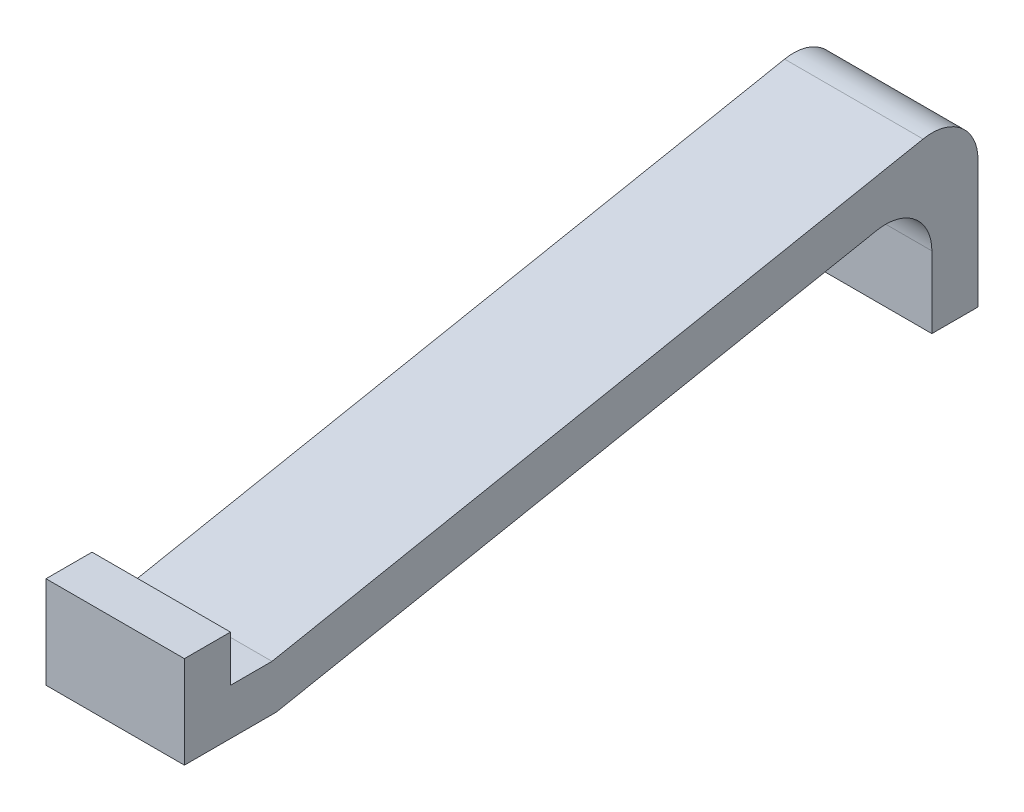
ISO-10303-21;
HEADER;
FILE_DESCRIPTION(('STEP AP214'),'2;1');
FILE_NAME('part.step','',(''),(''),'','','');
FILE_SCHEMA(('AUTOMOTIVE_DESIGN { 1 0 10303 214 1 1 1 1 }'));
ENDSEC;
DATA;
#1=APPLICATION_CONTEXT('core data for automotive mechanical design processes');
#2=APPLICATION_PROTOCOL_DEFINITION('international standard','automotive_design',2000,#1);
#3=PRODUCT_CONTEXT('',#1,'mechanical');
#4=PRODUCT('Part','Part','',(#3));
#5=PRODUCT_RELATED_PRODUCT_CATEGORY('part','',(#4));
#6=PRODUCT_DEFINITION_FORMATION('','',#4);
#7=PRODUCT_DEFINITION_CONTEXT('part definition',#1,'design');
#8=PRODUCT_DEFINITION('design','',#6,#7);
#9=PRODUCT_DEFINITION_SHAPE('','',#8);
#10=(LENGTH_UNIT() NAMED_UNIT(*) SI_UNIT(.MILLI.,.METRE.));
#11=(NAMED_UNIT(*) PLANE_ANGLE_UNIT() SI_UNIT($,.RADIAN.));
#12=(NAMED_UNIT(*) SI_UNIT($,.STERADIAN.) SOLID_ANGLE_UNIT());
#13=UNCERTAINTY_MEASURE_WITH_UNIT(LENGTH_MEASURE(1.E-05),#10,'distance_accuracy_value','');
#14=(GEOMETRIC_REPRESENTATION_CONTEXT(3) GLOBAL_UNCERTAINTY_ASSIGNED_CONTEXT((#13)) GLOBAL_UNIT_ASSIGNED_CONTEXT((#10,
#11,#12)) REPRESENTATION_CONTEXT('',''));
#15=CARTESIAN_POINT('',(0.,0.,0.));
#16=DIRECTION('',(0.,0.,1.));
#17=DIRECTION('',(1.,0.,0.));
#18=AXIS2_PLACEMENT_3D('',#15,#16,#17);
#19=CARTESIAN_POINT('',(30.,20.,102.260641264814));
#20=DIRECTION('',(0.,0.,-1.));
#21=DIRECTION('',(-1.,0.,0.));
#22=AXIS2_PLACEMENT_3D('',#19,#20,#21);
#23=PLANE('',#22);
#24=DIRECTION('',(0.,-1.,0.));
#25=VECTOR('',#24,1.);
#26=CARTESIAN_POINT('',(0.,20.,102.260641264814));
#27=LINE('',#26,#25);
#28=CARTESIAN_POINT('',(0.,20.,102.260641264814));
#29=VERTEX_POINT('',#28);
#30=CARTESIAN_POINT('',(0.,0.,102.260641264814));
#31=VERTEX_POINT('',#30);
#32=EDGE_CURVE('E153',#29,#31,#27,.T.);
#33=ORIENTED_EDGE('',*,*,#32,.T.);
#34=DIRECTION('',(-1.,0.,0.));
#35=VECTOR('',#34,1.);
#36=CARTESIAN_POINT('',(30.,0.,102.260641264814));
#37=LINE('',#36,#35);
#38=CARTESIAN_POINT('',(30.,0.,102.260641264814));
#39=VERTEX_POINT('',#38);
#40=EDGE_CURVE('E11',#39,#31,#37,.T.);
#41=ORIENTED_EDGE('',*,*,#40,.F.);
#42=DIRECTION('',(0.,-1.,0.));
#43=VECTOR('',#42,1.);
#44=CARTESIAN_POINT('',(30.,20.,102.260641264814));
#45=LINE('',#44,#43);
#46=CARTESIAN_POINT('',(30.,20.,102.260641264814));
#47=VERTEX_POINT('',#46);
#48=EDGE_CURVE('E175',#47,#39,#45,.T.);
#49=ORIENTED_EDGE('',*,*,#48,.F.);
#50=DIRECTION('',(-1.,0.,0.));
#51=VECTOR('',#50,1.);
#52=CARTESIAN_POINT('',(30.,20.,102.260641264814));
#53=LINE('',#52,#51);
#54=EDGE_CURVE('E149',#47,#29,#53,.T.);
#55=ORIENTED_EDGE('',*,*,#54,.T.);
#56=EDGE_LOOP('',(#33,#41,#49,#55));
#57=FACE_BOUND('',#56,.T.);
#58=ADVANCED_FACE('F33',(#57),#23,.F.);
#59=CARTESIAN_POINT('',(30.,0.,102.260641264814));
#60=DIRECTION('',(0.,1.,0.));
#61=DIRECTION('',(0.,0.,1.));
#62=AXIS2_PLACEMENT_3D('',#59,#60,#61);
#63=PLANE('',#62);
#64=DIRECTION('',(0.,0.,-1.));
#65=VECTOR('',#64,1.);
#66=CARTESIAN_POINT('',(0.,0.,102.260641264814));
#67=LINE('',#66,#65);
#68=CARTESIAN_POINT('',(0.,0.,82.3073454082652));
#69=VERTEX_POINT('',#68);
#70=EDGE_CURVE('E156',#31,#69,#67,.T.);
#71=ORIENTED_EDGE('',*,*,#70,.T.);
#72=DIRECTION('',(-1.,0.,0.));
#73=VECTOR('',#72,1.);
#74=CARTESIAN_POINT('',(30.,0.,82.3073454082652));
#75=LINE('',#74,#73);
#76=CARTESIAN_POINT('',(30.,0.,82.3073454082652));
#77=VERTEX_POINT('',#76);
#78=EDGE_CURVE('E41',#77,#69,#75,.T.);
#79=ORIENTED_EDGE('',*,*,#78,.F.);
#80=DIRECTION('',(0.,0.,-1.));
#81=VECTOR('',#80,1.);
#82=CARTESIAN_POINT('',(30.,0.,102.260641264814));
#83=LINE('',#82,#81);
#84=EDGE_CURVE('E104',#39,#77,#83,.T.);
#85=ORIENTED_EDGE('',*,*,#84,.F.);
#86=ORIENTED_EDGE('',*,*,#40,.T.);
#87=EDGE_LOOP('',(#71,#79,#85,#86));
#88=FACE_BOUND('',#87,.T.);
#89=ADVANCED_FACE('F253',(#88),#63,.F.);
#90=CARTESIAN_POINT('',(30.,0.,82.3073454082652));
#91=DIRECTION('',(0.,0.981546986641816,0.191221110273866));
#92=DIRECTION('',(0.,-0.191221110273866,0.981546986641817));
#93=AXIS2_PLACEMENT_3D('',#90,#91,#92);
#94=PLANE('',#93);
#95=DIRECTION('',(0.,0.191221110273866,-0.981546986641816));
#96=VECTOR('',#95,1.);
#97=CARTESIAN_POINT('',(0.,0.,82.3073454082652));
#98=LINE('',#97,#96);
#99=CARTESIAN_POINT('',(0.,25.3526310835087,-47.8289068487149));
#100=VERTEX_POINT('',#99);
#101=EDGE_CURVE('E158',#69,#100,#98,.T.);
#102=ORIENTED_EDGE('',*,*,#101,.T.);
#103=DIRECTION('',(-1.,0.,0.));
#104=VECTOR('',#103,1.);
#105=CARTESIAN_POINT('',(30.,25.3526310835087,-47.8289068487149));
#106=LINE('',#105,#104);
#107=CARTESIAN_POINT('',(30.,25.3526310835087,-47.8289068487149));
#108=VERTEX_POINT('',#107);
#109=EDGE_CURVE('E194',#108,#100,#106,.T.);
#110=ORIENTED_EDGE('',*,*,#109,.F.);
#111=DIRECTION('',(0.,0.191221110273866,-0.981546986641816));
#112=VECTOR('',#111,1.);
#113=CARTESIAN_POINT('',(30.,0.,82.3073454082652));
#114=LINE('',#113,#112);
#115=EDGE_CURVE('E202',#77,#108,#114,.T.);
#116=ORIENTED_EDGE('',*,*,#115,.F.);
#117=ORIENTED_EDGE('',*,*,#78,.T.);
#118=EDGE_LOOP('',(#102,#110,#116,#117));
#119=FACE_BOUND('',#118,.T.);
#120=ADVANCED_FACE('F200',(#119),#94,.F.);
#121=CARTESIAN_POINT('',(30.,15.5371612170905,-49.7411179514537));
#122=DIRECTION('',(-1.,0.,0.));
#123=DIRECTION('',(0.,0.,1.));
#124=AXIS2_PLACEMENT_3D('',#121,#122,#123);
#125=CYLINDRICAL_SURFACE('',#124,10.);
#126=CARTESIAN_POINT('',(0.,15.5371612170905,-49.7411179514537));
#127=DIRECTION('',(-1.,0.,0.));
#128=DIRECTION('',(0.,0.,1.));
#129=AXIS2_PLACEMENT_3D('',#126,#127,#128);
#130=CIRCLE('',#129,10.);
#131=CARTESIAN_POINT('',(0.,15.5371612170904,-59.7411179514537));
#132=VERTEX_POINT('',#131);
#133=EDGE_CURVE('E160',#100,#132,#130,.T.);
#134=ORIENTED_EDGE('',*,*,#133,.T.);
#135=DIRECTION('',(-1.,0.,0.));
#136=VECTOR('',#135,1.);
#137=CARTESIAN_POINT('',(30.,15.5371612170904,-59.7411179514537));
#138=LINE('',#137,#136);
#139=CARTESIAN_POINT('',(30.,15.5371612170904,-59.7411179514537));
#140=VERTEX_POINT('',#139);
#141=EDGE_CURVE('E191',#140,#132,#138,.T.);
#142=ORIENTED_EDGE('',*,*,#141,.F.);
#143=CARTESIAN_POINT('',(30.,15.5371612170905,-49.7411179514537));
#144=DIRECTION('',(-1.,0.,0.));
#145=DIRECTION('',(0.,0.,1.));
#146=AXIS2_PLACEMENT_3D('',#143,#144,#145);
#147=CIRCLE('',#146,10.);
#148=EDGE_CURVE('E220',#108,#140,#147,.T.);
#149=ORIENTED_EDGE('',*,*,#148,.F.);
#150=ORIENTED_EDGE('',*,*,#109,.T.);
#151=EDGE_LOOP('',(#134,#142,#149,#150));
#152=FACE_BOUND('',#151,.T.);
#153=ADVANCED_FACE('F211',(#152),#125,.F.);
#154=CARTESIAN_POINT('',(30.,15.5371612170904,-59.7411179514537));
#155=DIRECTION('',(0.,0.,-1.));
#156=DIRECTION('',(0.,1.,0.));
#157=AXIS2_PLACEMENT_3D('',#154,#155,#156);
#158=PLANE('',#157);
#159=DIRECTION('',(0.,-1.,0.));
#160=VECTOR('',#159,1.);
#161=CARTESIAN_POINT('',(0.,15.5371612170904,-59.7411179514537));
#162=LINE('',#161,#160);
#163=CARTESIAN_POINT('',(0.,0.,-59.7411179514537));
#164=VERTEX_POINT('',#163);
#165=EDGE_CURVE('E162',#132,#164,#162,.T.);
#166=ORIENTED_EDGE('',*,*,#165,.T.);
#167=DIRECTION('',(-1.,0.,0.));
#168=VECTOR('',#167,1.);
#169=CARTESIAN_POINT('',(30.,0.,-59.7411179514537));
#170=LINE('',#169,#168);
#171=CARTESIAN_POINT('',(30.,0.,-59.7411179514537));
#172=VERTEX_POINT('',#171);
#173=EDGE_CURVE('E188',#172,#164,#170,.T.);
#174=ORIENTED_EDGE('',*,*,#173,.F.);
#175=DIRECTION('',(0.,-1.,0.));
#176=VECTOR('',#175,1.);
#177=CARTESIAN_POINT('',(30.,15.5371612170904,-59.7411179514537));
#178=LINE('',#177,#176);
#179=EDGE_CURVE('E217',#140,#172,#178,.T.);
#180=ORIENTED_EDGE('',*,*,#179,.F.);
#181=ORIENTED_EDGE('',*,*,#141,.T.);
#182=EDGE_LOOP('',(#166,#174,#180,#181));
#183=FACE_BOUND('',#182,.T.);
#184=ADVANCED_FACE('F215',(#183),#158,.F.);
#185=CARTESIAN_POINT('',(30.,0.,-59.7411179514537));
#186=DIRECTION('',(0.,1.,0.));
#187=DIRECTION('',(0.,0.,1.));
#188=AXIS2_PLACEMENT_3D('',#185,#186,#187);
#189=PLANE('',#188);
#190=DIRECTION('',(0.,0.,-1.));
#191=VECTOR('',#190,1.);
#192=CARTESIAN_POINT('',(0.,0.,-59.7411179514537));
#193=LINE('',#192,#191);
#194=CARTESIAN_POINT('',(0.,0.,-69.7411179514537));
#195=VERTEX_POINT('',#194);
#196=EDGE_CURVE('E164',#164,#195,#193,.T.);
#197=ORIENTED_EDGE('',*,*,#196,.T.);
#198=DIRECTION('',(-1.,0.,0.));
#199=VECTOR('',#198,1.);
#200=CARTESIAN_POINT('',(30.,0.,-69.7411179514537));
#201=LINE('',#200,#199);
#202=CARTESIAN_POINT('',(30.,0.,-69.7411179514537));
#203=VERTEX_POINT('',#202);
#204=EDGE_CURVE('E185',#203,#195,#201,.T.);
#205=ORIENTED_EDGE('',*,*,#204,.F.);
#206=DIRECTION('',(0.,0.,-1.));
#207=VECTOR('',#206,1.);
#208=CARTESIAN_POINT('',(30.,0.,-59.7411179514537));
#209=LINE('',#208,#207);
#210=EDGE_CURVE('E219',#172,#203,#209,.T.);
#211=ORIENTED_EDGE('',*,*,#210,.F.);
#212=ORIENTED_EDGE('',*,*,#173,.T.);
#213=EDGE_LOOP('',(#197,#205,#211,#212));
#214=FACE_BOUND('',#213,.T.);
#215=ADVANCED_FACE('F266',(#214),#189,.F.);
#216=CARTESIAN_POINT('',(30.,0.,-69.7411179514537));
#217=DIRECTION('',(0.,0.,1.));
#218=DIRECTION('',(1.,0.,0.));
#219=AXIS2_PLACEMENT_3D('',#216,#217,#218);
#220=PLANE('',#219);
#221=DIRECTION('',(0.,1.,0.));
#222=VECTOR('',#221,1.);
#223=CARTESIAN_POINT('',(0.,0.,-69.7411179514537));
#224=LINE('',#223,#222);
#225=CARTESIAN_POINT('',(0.,27.6733210391425,-69.7411179514537));
#226=VERTEX_POINT('',#225);
#227=EDGE_CURVE('E166',#195,#226,#224,.T.);
#228=ORIENTED_EDGE('',*,*,#227,.T.);
#229=DIRECTION('',(-1.,0.,0.));
#230=VECTOR('',#229,1.);
#231=CARTESIAN_POINT('',(30.,27.6733210391425,-69.7411179514537));
#232=LINE('',#231,#230);
#233=CARTESIAN_POINT('',(30.,27.6733210391425,-69.7411179514537));
#234=VERTEX_POINT('',#233);
#235=EDGE_CURVE('E182',#234,#226,#232,.T.);
#236=ORIENTED_EDGE('',*,*,#235,.F.);
#237=DIRECTION('',(0.,1.,0.));
#238=VECTOR('',#237,1.);
#239=CARTESIAN_POINT('',(30.,0.,-69.7411179514537));
#240=LINE('',#239,#238);
#241=EDGE_CURVE('E222',#203,#234,#240,.T.);
#242=ORIENTED_EDGE('',*,*,#241,.F.);
#243=ORIENTED_EDGE('',*,*,#204,.T.);
#244=EDGE_LOOP('',(#228,#236,#242,#243));
#245=FACE_BOUND('',#244,.T.);
#246=ADVANCED_FACE('F269',(#245),#220,.F.);
#247=CARTESIAN_POINT('',(30.,27.6733210391426,-59.7411179514537));
#248=DIRECTION('',(-1.,0.,0.));
#249=DIRECTION('',(0.,0.,1.));
#250=AXIS2_PLACEMENT_3D('',#247,#248,#249);
#251=CYLINDRICAL_SURFACE('',#250,10.);
#252=CARTESIAN_POINT('',(0.,27.6733210391426,-59.7411179514537));
#253=DIRECTION('',(1.,0.,0.));
#254=DIRECTION('',(0.,0.,-1.));
#255=AXIS2_PLACEMENT_3D('',#252,#253,#254);
#256=CIRCLE('',#255,10.);
#257=CARTESIAN_POINT('',(0.,37.4887909055607,-57.8289068487149));
#258=VERTEX_POINT('',#257);
#259=EDGE_CURVE('E168',#226,#258,#256,.T.);
#260=ORIENTED_EDGE('',*,*,#259,.T.);
#261=DIRECTION('',(-1.,0.,0.));
#262=VECTOR('',#261,1.);
#263=CARTESIAN_POINT('',(30.,37.4887909055607,-57.8289068487149));
#264=LINE('',#263,#262);
#265=CARTESIAN_POINT('',(30.,37.4887909055607,-57.8289068487149));
#266=VERTEX_POINT('',#265);
#267=EDGE_CURVE('E179',#266,#258,#264,.T.);
#268=ORIENTED_EDGE('',*,*,#267,.F.);
#269=CARTESIAN_POINT('',(30.,27.6733210391426,-59.7411179514537));
#270=DIRECTION('',(1.,0.,0.));
#271=DIRECTION('',(0.,0.,-1.));
#272=AXIS2_PLACEMENT_3D('',#269,#270,#271);
#273=CIRCLE('',#272,10.);
#274=EDGE_CURVE('E228',#234,#266,#273,.T.);
#275=ORIENTED_EDGE('',*,*,#274,.F.);
#276=ORIENTED_EDGE('',*,*,#235,.T.);
#277=EDGE_LOOP('',(#260,#268,#275,#276));
#278=FACE_BOUND('',#277,.T.);
#279=ADVANCED_FACE('F234',(#278),#251,.T.);
#280=CARTESIAN_POINT('',(30.,37.4887909055607,-57.8289068487149));
#281=DIRECTION('',(0.,-0.981546986641816,-0.191221110273866));
#282=DIRECTION('',(0.,0.191221110273866,-0.981546986641816));
#283=AXIS2_PLACEMENT_3D('',#280,#281,#282);
#284=PLANE('',#283);
#285=DIRECTION('',(0.,-0.191221110273866,0.981546986641816));
#286=VECTOR('',#285,1.);
#287=CARTESIAN_POINT('',(0.,37.4887909055607,-57.8289068487149));
#288=LINE('',#287,#286);
#289=CARTESIAN_POINT('',(0.,10.,83.2723546236052));
#290=VERTEX_POINT('',#289);
#291=EDGE_CURVE('E170',#258,#290,#288,.T.);
#292=ORIENTED_EDGE('',*,*,#291,.T.);
#293=DIRECTION('',(-1.,0.,0.));
#294=VECTOR('',#293,1.);
#295=CARTESIAN_POINT('',(30.,10.,83.2723546236052));
#296=LINE('',#295,#294);
#297=CARTESIAN_POINT('',(30.,10.,83.2723546236052));
#298=VERTEX_POINT('',#297);
#299=EDGE_CURVE('E144',#298,#290,#296,.T.);
#300=ORIENTED_EDGE('',*,*,#299,.F.);
#301=DIRECTION('',(0.,-0.191221110273866,0.981546986641816));
#302=VECTOR('',#301,1.);
#303=CARTESIAN_POINT('',(30.,37.4887909055607,-57.8289068487149));
#304=LINE('',#303,#302);
#305=EDGE_CURVE('E135',#266,#298,#304,.T.);
#306=ORIENTED_EDGE('',*,*,#305,.F.);
#307=ORIENTED_EDGE('',*,*,#267,.T.);
#308=EDGE_LOOP('',(#292,#300,#306,#307));
#309=FACE_BOUND('',#308,.T.);
#310=ADVANCED_FACE('F238',(#309),#284,.F.);
#311=CARTESIAN_POINT('',(30.,10.,83.2723546236052));
#312=DIRECTION('',(0.,-1.,0.));
#313=DIRECTION('',(0.,0.,-1.));
#314=AXIS2_PLACEMENT_3D('',#311,#312,#313);
#315=PLANE('',#314);
#316=DIRECTION('',(0.,0.,1.));
#317=VECTOR('',#316,1.);
#318=CARTESIAN_POINT('',(0.,10.,83.2723546236052));
#319=LINE('',#318,#317);
#320=CARTESIAN_POINT('',(0.,10.,92.2839933365398));
#321=VERTEX_POINT('',#320);
#322=EDGE_CURVE('E143',#290,#321,#319,.T.);
#323=ORIENTED_EDGE('',*,*,#322,.T.);
#324=DIRECTION('',(-1.,0.,0.));
#325=VECTOR('',#324,1.);
#326=CARTESIAN_POINT('',(30.,10.,92.2839933365398));
#327=LINE('',#326,#325);
#328=CARTESIAN_POINT('',(30.,10.,92.2839933365398));
#329=VERTEX_POINT('',#328);
#330=EDGE_CURVE('E140',#329,#321,#327,.T.);
#331=ORIENTED_EDGE('',*,*,#330,.F.);
#332=DIRECTION('',(0.,0.,1.));
#333=VECTOR('',#332,1.);
#334=CARTESIAN_POINT('',(30.,10.,83.2723546236052));
#335=LINE('',#334,#333);
#336=EDGE_CURVE('E129',#298,#329,#335,.T.);
#337=ORIENTED_EDGE('',*,*,#336,.F.);
#338=ORIENTED_EDGE('',*,*,#299,.T.);
#339=EDGE_LOOP('',(#323,#331,#337,#338));
#340=FACE_BOUND('',#339,.T.);
#341=ADVANCED_FACE('F141',(#340),#315,.F.);
#342=CARTESIAN_POINT('',(30.,10.,92.2839933365398));
#343=DIRECTION('',(0.,0.,1.));
#344=DIRECTION('',(1.,0.,0.));
#345=AXIS2_PLACEMENT_3D('',#342,#343,#344);
#346=PLANE('',#345);
#347=DIRECTION('',(0.,1.,0.));
#348=VECTOR('',#347,1.);
#349=CARTESIAN_POINT('',(0.,10.,92.2839933365398));
#350=LINE('',#349,#348);
#351=CARTESIAN_POINT('',(0.,20.,92.2839933365398));
#352=VERTEX_POINT('',#351);
#353=EDGE_CURVE('E90',#321,#352,#350,.T.);
#354=ORIENTED_EDGE('',*,*,#353,.T.);
#355=DIRECTION('',(-1.,0.,0.));
#356=VECTOR('',#355,1.);
#357=CARTESIAN_POINT('',(30.,20.,92.2839933365398));
#358=LINE('',#357,#356);
#359=CARTESIAN_POINT('',(30.,20.,92.2839933365398));
#360=VERTEX_POINT('',#359);
#361=EDGE_CURVE('E145',#360,#352,#358,.T.);
#362=ORIENTED_EDGE('',*,*,#361,.F.);
#363=DIRECTION('',(0.,1.,0.));
#364=VECTOR('',#363,1.);
#365=CARTESIAN_POINT('',(30.,10.,92.2839933365398));
#366=LINE('',#365,#364);
#367=EDGE_CURVE('E133',#329,#360,#366,.T.);
#368=ORIENTED_EDGE('',*,*,#367,.F.);
#369=ORIENTED_EDGE('',*,*,#330,.T.);
#370=EDGE_LOOP('',(#354,#362,#368,#369));
#371=FACE_BOUND('',#370,.T.);
#372=ADVANCED_FACE('F147',(#371),#346,.F.);
#373=CARTESIAN_POINT('',(30.,20.,92.2839933365398));
#374=DIRECTION('',(0.,-1.,0.));
#375=DIRECTION('',(0.,0.,-1.));
#376=AXIS2_PLACEMENT_3D('',#373,#374,#375);
#377=PLANE('',#376);
#378=DIRECTION('',(0.,0.,1.));
#379=VECTOR('',#378,1.);
#380=CARTESIAN_POINT('',(0.,20.,92.2839933365398));
#381=LINE('',#380,#379);
#382=EDGE_CURVE('E96',#352,#29,#381,.T.);
#383=ORIENTED_EDGE('',*,*,#382,.T.);
#384=ORIENTED_EDGE('',*,*,#54,.F.);
#385=DIRECTION('',(0.,0.,1.));
#386=VECTOR('',#385,1.);
#387=CARTESIAN_POINT('',(30.,20.,92.2839933365398));
#388=LINE('',#387,#386);
#389=EDGE_CURVE('E49',#360,#47,#388,.T.);
#390=ORIENTED_EDGE('',*,*,#389,.F.);
#391=ORIENTED_EDGE('',*,*,#361,.T.);
#392=EDGE_LOOP('',(#383,#384,#390,#391));
#393=FACE_BOUND('',#392,.T.);
#394=ADVANCED_FACE('F242',(#393),#377,.F.);
#395=CARTESIAN_POINT('',(30.,15.5371612170905,-49.7411179514537));
#396=DIRECTION('',(-1.,0.,0.));
#397=DIRECTION('',(0.,0.,1.));
#398=AXIS2_PLACEMENT_3D('',#395,#396,#397);
#399=PLANE('',#398);
#400=ORIENTED_EDGE('',*,*,#48,.T.);
#401=ORIENTED_EDGE('',*,*,#84,.T.);
#402=ORIENTED_EDGE('',*,*,#115,.T.);
#403=ORIENTED_EDGE('',*,*,#148,.T.);
#404=ORIENTED_EDGE('',*,*,#179,.T.);
#405=ORIENTED_EDGE('',*,*,#210,.T.);
#406=ORIENTED_EDGE('',*,*,#241,.T.);
#407=ORIENTED_EDGE('',*,*,#274,.T.);
#408=ORIENTED_EDGE('',*,*,#305,.T.);
#409=ORIENTED_EDGE('',*,*,#336,.T.);
#410=ORIENTED_EDGE('',*,*,#367,.T.);
#411=ORIENTED_EDGE('',*,*,#389,.T.);
#412=EDGE_LOOP('',(#400,#401,#402,#403,#404,#405,#406,#407,#408,#409,#410,#411));
#413=FACE_BOUND('',#412,.T.);
#414=ADVANCED_FACE('F131',(#413),#399,.F.);
#415=CARTESIAN_POINT('',(0.,15.5371612170905,-49.7411179514537));
#416=DIRECTION('',(-1.,0.,0.));
#417=DIRECTION('',(0.,0.,1.));
#418=AXIS2_PLACEMENT_3D('',#415,#416,#417);
#419=PLANE('',#418);
#420=ORIENTED_EDGE('',*,*,#32,.F.);
#421=ORIENTED_EDGE('',*,*,#382,.F.);
#422=ORIENTED_EDGE('',*,*,#353,.F.);
#423=ORIENTED_EDGE('',*,*,#322,.F.);
#424=ORIENTED_EDGE('',*,*,#291,.F.);
#425=ORIENTED_EDGE('',*,*,#259,.F.);
#426=ORIENTED_EDGE('',*,*,#227,.F.);
#427=ORIENTED_EDGE('',*,*,#196,.F.);
#428=ORIENTED_EDGE('',*,*,#165,.F.);
#429=ORIENTED_EDGE('',*,*,#133,.F.);
#430=ORIENTED_EDGE('',*,*,#101,.F.);
#431=ORIENTED_EDGE('',*,*,#70,.F.);
#432=EDGE_LOOP('',(#420,#421,#422,#423,#424,#425,#426,#427,#428,#429,#430,#431));
#433=FACE_BOUND('',#432,.T.);
#434=ADVANCED_FACE('F206',(#433),#419,.T.);
#435=CLOSED_SHELL('',(#58,#89,#120,#153,#184,#215,#246,#279,#310,#341,#372,#394,#414,#434));
#436=MANIFOLD_SOLID_BREP('B2',#435);
#437=ADVANCED_BREP_SHAPE_REPRESENTATION('',(#18,#436),#14);
#438=SHAPE_DEFINITION_REPRESENTATION(#9,#437);
ENDSEC;
END-ISO-10303-21;
